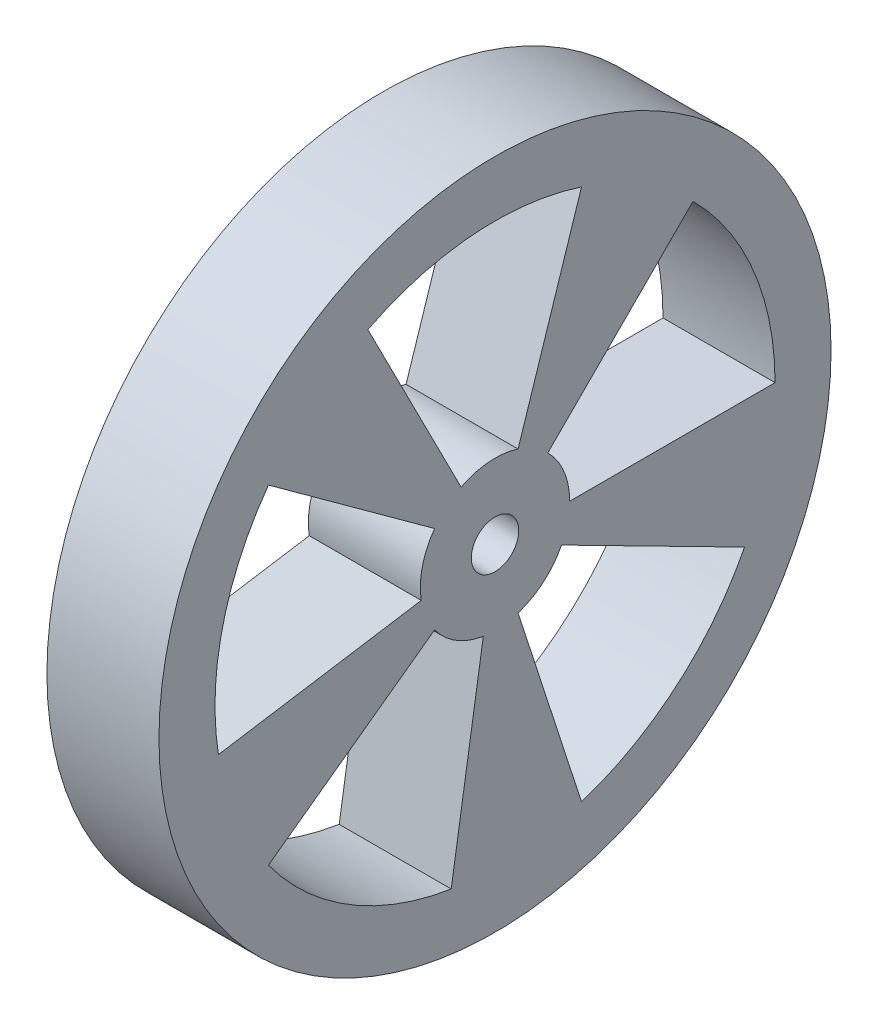
ISO-10303-21;
HEADER;
FILE_DESCRIPTION(('STEP AP214'),'2;1');
FILE_NAME('part.step','',(''),(''),'','','');
FILE_SCHEMA(('AUTOMOTIVE_DESIGN { 1 0 10303 214 1 1 1 1 }'));
ENDSEC;
DATA;
#1=APPLICATION_CONTEXT('core data for automotive mechanical design processes');
#2=APPLICATION_PROTOCOL_DEFINITION('international standard','automotive_design',2000,#1);
#3=PRODUCT_CONTEXT('',#1,'mechanical');
#4=PRODUCT('Part','Part','',(#3));
#5=PRODUCT_RELATED_PRODUCT_CATEGORY('part','',(#4));
#6=PRODUCT_DEFINITION_FORMATION('','',#4);
#7=PRODUCT_DEFINITION_CONTEXT('part definition',#1,'design');
#8=PRODUCT_DEFINITION('design','',#6,#7);
#9=PRODUCT_DEFINITION_SHAPE('','',#8);
#10=(LENGTH_UNIT() NAMED_UNIT(*) SI_UNIT(.MILLI.,.METRE.));
#11=(NAMED_UNIT(*) PLANE_ANGLE_UNIT() SI_UNIT($,.RADIAN.));
#12=(NAMED_UNIT(*) SI_UNIT($,.STERADIAN.) SOLID_ANGLE_UNIT());
#13=UNCERTAINTY_MEASURE_WITH_UNIT(LENGTH_MEASURE(1.E-05),#10,'distance_accuracy_value','');
#14=(GEOMETRIC_REPRESENTATION_CONTEXT(3) GLOBAL_UNCERTAINTY_ASSIGNED_CONTEXT((#13)) GLOBAL_UNIT_ASSIGNED_CONTEXT((#10,
#11,#12)) REPRESENTATION_CONTEXT('',''));
#15=CARTESIAN_POINT('',(0.,0.,0.));
#16=DIRECTION('',(0.,0.,1.));
#17=DIRECTION('',(1.,0.,0.));
#18=AXIS2_PLACEMENT_3D('',#15,#16,#17);
#19=CARTESIAN_POINT('',(30.,0.,0.));
#20=DIRECTION('',(-1.,0.,0.));
#21=DIRECTION('',(0.,0.,1.));
#22=AXIS2_PLACEMENT_3D('',#19,#20,#21);
#23=CYLINDRICAL_SURFACE('',#22,90.);
#24=CARTESIAN_POINT('',(30.,0.,0.));
#25=DIRECTION('',(1.,0.,0.));
#26=DIRECTION('',(0.,0.,-1.));
#27=AXIS2_PLACEMENT_3D('',#24,#25,#26);
#28=CIRCLE('',#27,90.);
#29=CARTESIAN_POINT('',(30.,0.,-90.));
#30=VERTEX_POINT('',#29);
#31=EDGE_CURVE('E11',#30,#30,#28,.T.);
#32=ORIENTED_EDGE('',*,*,#31,.F.);
#33=EDGE_LOOP('',(#32));
#34=FACE_BOUND('',#33,.T.);
#35=CARTESIAN_POINT('',(0.,0.,0.));
#36=DIRECTION('',(1.,0.,0.));
#37=DIRECTION('',(0.,0.,-1.));
#38=AXIS2_PLACEMENT_3D('',#35,#36,#37);
#39=CIRCLE('',#38,90.);
#40=CARTESIAN_POINT('',(0.,0.,-90.));
#41=VERTEX_POINT('',#40);
#42=EDGE_CURVE('E42',#41,#41,#39,.T.);
#43=ORIENTED_EDGE('',*,*,#42,.T.);
#44=EDGE_LOOP('',(#43));
#45=FACE_BOUND('',#44,.T.);
#46=ADVANCED_FACE('F39',(#34,#45),#23,.T.);
#47=CARTESIAN_POINT('',(30.,0.,0.));
#48=DIRECTION('',(1.,0.,0.));
#49=DIRECTION('',(0.,0.,-1.));
#50=AXIS2_PLACEMENT_3D('',#47,#48,#49);
#51=PLANE('',#50);
#52=CARTESIAN_POINT('',(30.,0.,0.));
#53=DIRECTION('',(-1.,0.,0.));
#54=DIRECTION('',(0.,-0.95105651629515,-0.309016994374958));
#55=AXIS2_PLACEMENT_3D('',#52,#53,#54);
#56=CIRCLE('',#55,75.);
#57=CARTESIAN_POINT('',(30.,-34.0492874804656,-66.8254893141278));
#58=VERTEX_POINT('',#57);
#59=CARTESIAN_POINT('',(30.,-71.3292387221363,-23.1762745781219));
#60=VERTEX_POINT('',#59);
#61=EDGE_CURVE('E250',#58,#60,#56,.T.);
#62=ORIENTED_EDGE('',*,*,#61,.T.);
#63=DIRECTION('',(0.,0.95105651629515,0.309016994374958));
#64=VECTOR('',#63,1.);
#65=CARTESIAN_POINT('',(30.,-19.021130325903,-6.18033988749916));
#66=LINE('',#65,#64);
#67=CARTESIAN_POINT('',(30.,-19.021130325903,-6.18033988749916));
#68=VERTEX_POINT('',#67);
#69=EDGE_CURVE('E253',#60,#68,#66,.T.);
#70=ORIENTED_EDGE('',*,*,#69,.T.);
#71=CARTESIAN_POINT('',(30.,0.,0.));
#72=DIRECTION('',(1.,0.,0.));
#73=DIRECTION('',(0.,0.95105651629515,0.309016994374958));
#74=AXIS2_PLACEMENT_3D('',#71,#72,#73);
#75=CIRCLE('',#74,20.);
#76=CARTESIAN_POINT('',(30.,-9.07980999479084,-17.8201304837674));
#77=VERTEX_POINT('',#76);
#78=EDGE_CURVE('E53',#68,#77,#75,.T.);
#79=ORIENTED_EDGE('',*,*,#78,.T.);
#80=DIRECTION('',(0.,-0.453990499739542,-0.89100652418837));
#81=VECTOR('',#80,1.);
#82=CARTESIAN_POINT('',(30.,-34.0492874804656,-66.8254893141278));
#83=LINE('',#82,#81);
#84=EDGE_CURVE('E258',#77,#58,#83,.T.);
#85=ORIENTED_EDGE('',*,*,#84,.T.);
#86=EDGE_LOOP('',(#62,#70,#79,#85));
#87=FACE_BOUND('',#86,.T.);
#88=CARTESIAN_POINT('',(30.,0.,0.));
#89=DIRECTION('',(-1.,0.,0.));
#90=DIRECTION('',(0.,-0.58778525229248,0.809016994374942));
#91=AXIS2_PLACEMENT_3D('',#88,#89,#90);
#92=CIRCLE('',#91,75.);
#93=CARTESIAN_POINT('',(30.,-74.0766255446354,11.7325848780171));
#94=VERTEX_POINT('',#93);
#95=CARTESIAN_POINT('',(30.,-44.083893921936,60.6762745781207));
#96=VERTEX_POINT('',#95);
#97=EDGE_CURVE('E220',#94,#96,#92,.T.);
#98=ORIENTED_EDGE('',*,*,#97,.T.);
#99=DIRECTION('',(0.,0.58778525229248,-0.809016994374942));
#100=VECTOR('',#99,1.);
#101=CARTESIAN_POINT('',(30.,-11.7557050458496,16.1803398874988));
#102=LINE('',#101,#100);
#103=CARTESIAN_POINT('',(30.,-11.7557050458496,16.1803398874988));
#104=VERTEX_POINT('',#103);
#105=EDGE_CURVE('E223',#96,#104,#102,.T.);
#106=ORIENTED_EDGE('',*,*,#105,.T.);
#107=CARTESIAN_POINT('',(30.,0.,0.));
#108=DIRECTION('',(1.,0.,0.));
#109=DIRECTION('',(0.,0.58778525229248,-0.809016994374942));
#110=AXIS2_PLACEMENT_3D('',#107,#108,#109);
#111=CIRCLE('',#110,20.);
#112=CARTESIAN_POINT('',(30.,-19.7537668119028,3.12868930080456));
#113=VERTEX_POINT('',#112);
#114=EDGE_CURVE('E61',#104,#113,#111,.T.);
#115=ORIENTED_EDGE('',*,*,#114,.T.);
#116=DIRECTION('',(0.,-0.987688340595138,0.156434465040228));
#117=VECTOR('',#116,1.);
#118=CARTESIAN_POINT('',(30.,-74.0766255446354,11.7325848780171));
#119=LINE('',#118,#117);
#120=EDGE_CURVE('E228',#113,#94,#119,.T.);
#121=ORIENTED_EDGE('',*,*,#120,.T.);
#122=EDGE_LOOP('',(#98,#106,#115,#121));
#123=FACE_BOUND('',#122,.T.);
#124=CARTESIAN_POINT('',(30.,0.,0.));
#125=DIRECTION('',(-1.,0.,0.));
#126=DIRECTION('',(0.,0.587785252292469,0.809016994374951));
#127=AXIS2_PLACEMENT_3D('',#124,#125,#126);
#128=CIRCLE('',#127,75.);
#129=CARTESIAN_POINT('',(30.,-11.7325848780173,74.0766255446353));
#130=VERTEX_POINT('',#129);
#131=CARTESIAN_POINT('',(30.,44.0838939219352,60.6762745781213));
#132=VERTEX_POINT('',#131);
#133=EDGE_CURVE('E179',#130,#132,#128,.T.);
#134=ORIENTED_EDGE('',*,*,#133,.T.);
#135=DIRECTION('',(0.,-0.587785252292469,-0.809016994374951));
#136=VECTOR('',#135,1.);
#137=CARTESIAN_POINT('',(30.,11.7557050458494,16.180339887499));
#138=LINE('',#137,#136);
#139=CARTESIAN_POINT('',(30.,11.7557050458494,16.180339887499));
#140=VERTEX_POINT('',#139);
#141=EDGE_CURVE('E191',#132,#140,#138,.T.);
#142=ORIENTED_EDGE('',*,*,#141,.T.);
#143=CARTESIAN_POINT('',(30.,0.,0.));
#144=DIRECTION('',(1.,0.,0.));
#145=DIRECTION('',(0.,-0.587785252292469,-0.809016994374951));
#146=AXIS2_PLACEMENT_3D('',#143,#144,#145);
#147=CIRCLE('',#146,20.);
#148=CARTESIAN_POINT('',(30.,-3.12868930080461,19.7537668119028));
#149=VERTEX_POINT('',#148);
#150=EDGE_CURVE('E195',#140,#149,#147,.T.);
#151=ORIENTED_EDGE('',*,*,#150,.T.);
#152=DIRECTION('',(0.,-0.156434465040231,0.987688340595138));
#153=VECTOR('',#152,1.);
#154=CARTESIAN_POINT('',(30.,-11.7325848780173,74.0766255446353));
#155=LINE('',#154,#153);
#156=EDGE_CURVE('E187',#149,#130,#155,.T.);
#157=ORIENTED_EDGE('',*,*,#156,.T.);
#158=EDGE_LOOP('',(#134,#142,#151,#157));
#159=FACE_BOUND('',#158,.T.);
#160=CARTESIAN_POINT('',(30.,0.,0.));
#161=DIRECTION('',(-1.,0.,0.));
#162=DIRECTION('',(0.,0.951056516295155,-0.309016994374945));
#163=AXIS2_PLACEMENT_3D('',#160,#161,#162);
#164=CIRCLE('',#163,75.);
#165=CARTESIAN_POINT('',(30.,66.8254893141277,34.0492874804658));
#166=VERTEX_POINT('',#165);
#167=CARTESIAN_POINT('',(30.,71.3292387221366,-23.1762745781209));
#168=VERTEX_POINT('',#167);
#169=EDGE_CURVE('E279',#166,#168,#164,.T.);
#170=ORIENTED_EDGE('',*,*,#169,.T.);
#171=DIRECTION('',(0.,-0.951056516295155,0.309016994374945));
#172=VECTOR('',#171,1.);
#173=CARTESIAN_POINT('',(30.,19.0211303259031,-6.1803398874989));
#174=LINE('',#173,#172);
#175=CARTESIAN_POINT('',(30.,19.0211303259031,-6.1803398874989));
#176=VERTEX_POINT('',#175);
#177=EDGE_CURVE('E282',#168,#176,#174,.T.);
#178=ORIENTED_EDGE('',*,*,#177,.T.);
#179=CARTESIAN_POINT('',(30.,0.,0.));
#180=DIRECTION('',(1.,0.,0.));
#181=DIRECTION('',(0.,-0.951056516295155,0.309016994374945));
#182=AXIS2_PLACEMENT_3D('',#179,#180,#181);
#183=CIRCLE('',#182,20.);
#184=CARTESIAN_POINT('',(30.,17.8201304837674,9.07980999479088));
#185=VERTEX_POINT('',#184);
#186=EDGE_CURVE('E286',#176,#185,#183,.T.);
#187=ORIENTED_EDGE('',*,*,#186,.T.);
#188=DIRECTION('',(0.,0.891006524188369,0.453990499739544));
#189=VECTOR('',#188,1.);
#190=CARTESIAN_POINT('',(30.,66.8254893141277,34.0492874804658));
#191=LINE('',#190,#189);
#192=EDGE_CURVE('E289',#185,#166,#191,.T.);
#193=ORIENTED_EDGE('',*,*,#192,.T.);
#194=EDGE_LOOP('',(#170,#178,#187,#193));
#195=FACE_BOUND('',#194,.T.);
#196=CARTESIAN_POINT('',(30.,0.,0.));
#197=DIRECTION('',(-1.,0.,0.));
#198=DIRECTION('',(0.,0.,-1.));
#199=AXIS2_PLACEMENT_3D('',#196,#197,#198);
#200=CIRCLE('',#199,75.);
#201=CARTESIAN_POINT('',(30.,53.0330085889908,-53.0330085889914));
#202=VERTEX_POINT('',#201);
#203=CARTESIAN_POINT('',(30.,0.,-75.));
#204=VERTEX_POINT('',#203);
#205=EDGE_CURVE('E311',#202,#204,#200,.T.);
#206=ORIENTED_EDGE('',*,*,#205,.T.);
#207=DIRECTION('',(0.,0.,1.));
#208=VECTOR('',#207,1.);
#209=CARTESIAN_POINT('',(30.,0.,-20.));
#210=LINE('',#209,#208);
#211=CARTESIAN_POINT('',(30.,0.,-20.));
#212=VERTEX_POINT('',#211);
#213=EDGE_CURVE('E314',#204,#212,#210,.T.);
#214=ORIENTED_EDGE('',*,*,#213,.T.);
#215=CARTESIAN_POINT('',(30.,0.,0.));
#216=DIRECTION('',(1.,0.,0.));
#217=DIRECTION('',(0.,0.,1.));
#218=AXIS2_PLACEMENT_3D('',#215,#216,#217);
#219=CIRCLE('',#218,20.);
#220=CARTESIAN_POINT('',(30.,14.1421356237309,-14.142135623731));
#221=VERTEX_POINT('',#220);
#222=EDGE_CURVE('E318',#212,#221,#219,.T.);
#223=ORIENTED_EDGE('',*,*,#222,.T.);
#224=DIRECTION('',(0.,0.707106781186543,-0.707106781186552));
#225=VECTOR('',#224,1.);
#226=CARTESIAN_POINT('',(30.,53.0330085889908,-53.0330085889914));
#227=LINE('',#226,#225);
#228=EDGE_CURVE('E321',#221,#202,#227,.T.);
#229=ORIENTED_EDGE('',*,*,#228,.T.);
#230=EDGE_LOOP('',(#206,#214,#223,#229));
#231=FACE_BOUND('',#230,.T.);
#232=CARTESIAN_POINT('',(30.,0.,0.));
#233=DIRECTION('',(-1.,0.,0.));
#234=DIRECTION('',(0.,0.,1.));
#235=AXIS2_PLACEMENT_3D('',#232,#233,#234);
#236=CIRCLE('',#235,6.35);
#237=CARTESIAN_POINT('',(30.,0.,6.35));
#238=VERTEX_POINT('',#237);
#239=EDGE_CURVE('E343',#238,#238,#236,.T.);
#240=ORIENTED_EDGE('',*,*,#239,.T.);
#241=EDGE_LOOP('',(#240));
#242=FACE_BOUND('',#241,.T.);
#243=ORIENTED_EDGE('',*,*,#31,.T.);
#244=EDGE_LOOP('',(#243));
#245=FACE_BOUND('',#244,.T.);
#246=ADVANCED_FACE('F197',(#87,#123,#159,#195,#231,#242,#245),#51,.T.);
#247=CARTESIAN_POINT('',(0.,0.,0.));
#248=DIRECTION('',(1.,0.,0.));
#249=DIRECTION('',(0.,0.,-1.));
#250=AXIS2_PLACEMENT_3D('',#247,#248,#249);
#251=PLANE('',#250);
#252=DIRECTION('',(0.,0.95105651629515,0.309016994374958));
#253=VECTOR('',#252,1.);
#254=CARTESIAN_POINT('',(0.,-19.021130325903,-6.18033988749916));
#255=LINE('',#254,#253);
#256=CARTESIAN_POINT('',(0.,-71.3292387221363,-23.1762745781219));
#257=VERTEX_POINT('',#256);
#258=CARTESIAN_POINT('',(0.,-19.021130325903,-6.18033988749916));
#259=VERTEX_POINT('',#258);
#260=EDGE_CURVE('E264',#257,#259,#255,.T.);
#261=ORIENTED_EDGE('',*,*,#260,.F.);
#262=CARTESIAN_POINT('',(0.,0.,0.));
#263=DIRECTION('',(-1.,0.,0.));
#264=DIRECTION('',(0.,-0.95105651629515,-0.309016994374958));
#265=AXIS2_PLACEMENT_3D('',#262,#263,#264);
#266=CIRCLE('',#265,75.);
#267=CARTESIAN_POINT('',(0.,-34.0492874804656,-66.8254893141278));
#268=VERTEX_POINT('',#267);
#269=EDGE_CURVE('E262',#268,#257,#266,.T.);
#270=ORIENTED_EDGE('',*,*,#269,.F.);
#271=DIRECTION('',(0.,-0.453990499739542,-0.89100652418837));
#272=VECTOR('',#271,1.);
#273=CARTESIAN_POINT('',(0.,-34.0492874804656,-66.8254893141278));
#274=LINE('',#273,#272);
#275=CARTESIAN_POINT('',(0.,-9.07980999479084,-17.8201304837674));
#276=VERTEX_POINT('',#275);
#277=EDGE_CURVE('E254',#276,#268,#274,.T.);
#278=ORIENTED_EDGE('',*,*,#277,.F.);
#279=CARTESIAN_POINT('',(0.,0.,0.));
#280=DIRECTION('',(1.,0.,0.));
#281=DIRECTION('',(0.,0.95105651629515,0.309016994374958));
#282=AXIS2_PLACEMENT_3D('',#279,#280,#281);
#283=CIRCLE('',#282,20.);
#284=EDGE_CURVE('E267',#259,#276,#283,.T.);
#285=ORIENTED_EDGE('',*,*,#284,.F.);
#286=EDGE_LOOP('',(#261,#270,#278,#285));
#287=FACE_BOUND('',#286,.T.);
#288=DIRECTION('',(0.,0.58778525229248,-0.809016994374942));
#289=VECTOR('',#288,1.);
#290=CARTESIAN_POINT('',(0.,-11.7557050458496,16.1803398874988));
#291=LINE('',#290,#289);
#292=CARTESIAN_POINT('',(0.,-44.083893921936,60.6762745781207));
#293=VERTEX_POINT('',#292);
#294=CARTESIAN_POINT('',(0.,-11.7557050458496,16.1803398874988));
#295=VERTEX_POINT('',#294);
#296=EDGE_CURVE('E234',#293,#295,#291,.T.);
#297=ORIENTED_EDGE('',*,*,#296,.F.);
#298=CARTESIAN_POINT('',(0.,0.,0.));
#299=DIRECTION('',(-1.,0.,0.));
#300=DIRECTION('',(0.,-0.58778525229248,0.809016994374942));
#301=AXIS2_PLACEMENT_3D('',#298,#299,#300);
#302=CIRCLE('',#301,75.);
#303=CARTESIAN_POINT('',(0.,-74.0766255446354,11.7325848780171));
#304=VERTEX_POINT('',#303);
#305=EDGE_CURVE('E232',#304,#293,#302,.T.);
#306=ORIENTED_EDGE('',*,*,#305,.F.);
#307=DIRECTION('',(0.,-0.987688340595138,0.156434465040228));
#308=VECTOR('',#307,1.);
#309=CARTESIAN_POINT('',(0.,-74.0766255446354,11.7325848780171));
#310=LINE('',#309,#308);
#311=CARTESIAN_POINT('',(0.,-19.7537668119028,3.12868930080456));
#312=VERTEX_POINT('',#311);
#313=EDGE_CURVE('E224',#312,#304,#310,.T.);
#314=ORIENTED_EDGE('',*,*,#313,.F.);
#315=CARTESIAN_POINT('',(0.,0.,0.));
#316=DIRECTION('',(1.,0.,0.));
#317=DIRECTION('',(0.,0.58778525229248,-0.809016994374942));
#318=AXIS2_PLACEMENT_3D('',#315,#316,#317);
#319=CIRCLE('',#318,20.);
#320=EDGE_CURVE('E238',#295,#312,#319,.T.);
#321=ORIENTED_EDGE('',*,*,#320,.F.);
#322=EDGE_LOOP('',(#297,#306,#314,#321));
#323=FACE_BOUND('',#322,.T.);
#324=DIRECTION('',(0.,-0.587785252292469,-0.809016994374951));
#325=VECTOR('',#324,1.);
#326=CARTESIAN_POINT('',(0.,11.7557050458494,16.180339887499));
#327=LINE('',#326,#325);
#328=CARTESIAN_POINT('',(0.,44.0838939219351,60.6762745781213));
#329=VERTEX_POINT('',#328);
#330=CARTESIAN_POINT('',(0.,11.7557050458494,16.180339887499));
#331=VERTEX_POINT('',#330);
#332=EDGE_CURVE('E209',#329,#331,#327,.T.);
#333=ORIENTED_EDGE('',*,*,#332,.F.);
#334=CARTESIAN_POINT('',(0.,0.,0.));
#335=DIRECTION('',(-1.,0.,0.));
#336=DIRECTION('',(0.,0.587785252292469,0.809016994374951));
#337=AXIS2_PLACEMENT_3D('',#334,#335,#336);
#338=CIRCLE('',#337,75.);
#339=CARTESIAN_POINT('',(0.,-11.7325848780173,74.0766255446353));
#340=VERTEX_POINT('',#339);
#341=EDGE_CURVE('E182',#340,#329,#338,.T.);
#342=ORIENTED_EDGE('',*,*,#341,.F.);
#343=DIRECTION('',(0.,-0.156434465040231,0.987688340595138));
#344=VECTOR('',#343,1.);
#345=CARTESIAN_POINT('',(0.,-11.7325848780173,74.0766255446353));
#346=LINE('',#345,#344);
#347=CARTESIAN_POINT('',(0.,-3.12868930080461,19.7537668119028));
#348=VERTEX_POINT('',#347);
#349=EDGE_CURVE('E200',#348,#340,#346,.T.);
#350=ORIENTED_EDGE('',*,*,#349,.F.);
#351=CARTESIAN_POINT('',(0.,0.,0.));
#352=DIRECTION('',(1.,0.,0.));
#353=DIRECTION('',(0.,-0.587785252292469,-0.809016994374951));
#354=AXIS2_PLACEMENT_3D('',#351,#352,#353);
#355=CIRCLE('',#354,20.);
#356=EDGE_CURVE('E203',#331,#348,#355,.T.);
#357=ORIENTED_EDGE('',*,*,#356,.F.);
#358=EDGE_LOOP('',(#333,#342,#350,#357));
#359=FACE_BOUND('',#358,.T.);
#360=DIRECTION('',(0.,-0.951056516295155,0.309016994374945));
#361=VECTOR('',#360,1.);
#362=CARTESIAN_POINT('',(0.,19.0211303259031,-6.1803398874989));
#363=LINE('',#362,#361);
#364=CARTESIAN_POINT('',(0.,71.3292387221366,-23.1762745781209));
#365=VERTEX_POINT('',#364);
#366=CARTESIAN_POINT('',(0.,19.0211303259031,-6.1803398874989));
#367=VERTEX_POINT('',#366);
#368=EDGE_CURVE('E294',#365,#367,#363,.T.);
#369=ORIENTED_EDGE('',*,*,#368,.F.);
#370=CARTESIAN_POINT('',(0.,0.,0.));
#371=DIRECTION('',(-1.,0.,0.));
#372=DIRECTION('',(0.,0.951056516295155,-0.309016994374945));
#373=AXIS2_PLACEMENT_3D('',#370,#371,#372);
#374=CIRCLE('',#373,75.);
#375=CARTESIAN_POINT('',(0.,66.8254893141277,34.0492874804658));
#376=VERTEX_POINT('',#375);
#377=EDGE_CURVE('E216',#376,#365,#374,.T.);
#378=ORIENTED_EDGE('',*,*,#377,.F.);
#379=DIRECTION('',(0.,0.891006524188369,0.453990499739544));
#380=VECTOR('',#379,1.);
#381=CARTESIAN_POINT('',(0.,66.8254893141277,34.0492874804658));
#382=LINE('',#381,#380);
#383=CARTESIAN_POINT('',(0.,17.8201304837674,9.07980999479088));
#384=VERTEX_POINT('',#383);
#385=EDGE_CURVE('E283',#384,#376,#382,.T.);
#386=ORIENTED_EDGE('',*,*,#385,.F.);
#387=CARTESIAN_POINT('',(0.,0.,0.));
#388=DIRECTION('',(1.,0.,0.));
#389=DIRECTION('',(0.,-0.951056516295155,0.309016994374945));
#390=AXIS2_PLACEMENT_3D('',#387,#388,#389);
#391=CIRCLE('',#390,20.);
#392=EDGE_CURVE('E297',#367,#384,#391,.T.);
#393=ORIENTED_EDGE('',*,*,#392,.F.);
#394=EDGE_LOOP('',(#369,#378,#386,#393));
#395=FACE_BOUND('',#394,.T.);
#396=DIRECTION('',(0.,0.,1.));
#397=VECTOR('',#396,1.);
#398=CARTESIAN_POINT('',(0.,0.,-20.));
#399=LINE('',#398,#397);
#400=CARTESIAN_POINT('',(0.,0.,-75.));
#401=VERTEX_POINT('',#400);
#402=CARTESIAN_POINT('',(0.,0.,-20.));
#403=VERTEX_POINT('',#402);
#404=EDGE_CURVE('E326',#401,#403,#399,.T.);
#405=ORIENTED_EDGE('',*,*,#404,.F.);
#406=CARTESIAN_POINT('',(0.,0.,0.));
#407=DIRECTION('',(-1.,0.,0.));
#408=DIRECTION('',(0.,0.,-1.));
#409=AXIS2_PLACEMENT_3D('',#406,#407,#408);
#410=CIRCLE('',#409,75.);
#411=CARTESIAN_POINT('',(0.,53.0330085889908,-53.0330085889914));
#412=VERTEX_POINT('',#411);
#413=EDGE_CURVE('E304',#412,#401,#410,.T.);
#414=ORIENTED_EDGE('',*,*,#413,.F.);
#415=DIRECTION('',(0.,0.707106781186543,-0.707106781186552));
#416=VECTOR('',#415,1.);
#417=CARTESIAN_POINT('',(0.,53.0330085889908,-53.0330085889914));
#418=LINE('',#417,#416);
#419=CARTESIAN_POINT('',(0.,14.1421356237309,-14.142135623731));
#420=VERTEX_POINT('',#419);
#421=EDGE_CURVE('E315',#420,#412,#418,.T.);
#422=ORIENTED_EDGE('',*,*,#421,.F.);
#423=CARTESIAN_POINT('',(0.,0.,0.));
#424=DIRECTION('',(1.,0.,0.));
#425=DIRECTION('',(0.,0.,1.));
#426=AXIS2_PLACEMENT_3D('',#423,#424,#425);
#427=CIRCLE('',#426,20.);
#428=EDGE_CURVE('E329',#403,#420,#427,.T.);
#429=ORIENTED_EDGE('',*,*,#428,.F.);
#430=EDGE_LOOP('',(#405,#414,#422,#429));
#431=FACE_BOUND('',#430,.T.);
#432=CARTESIAN_POINT('',(0.,0.,0.));
#433=DIRECTION('',(-1.,0.,0.));
#434=DIRECTION('',(0.,0.,1.));
#435=AXIS2_PLACEMENT_3D('',#432,#433,#434);
#436=CIRCLE('',#435,6.35);
#437=CARTESIAN_POINT('',(0.,0.,6.35));
#438=VERTEX_POINT('',#437);
#439=EDGE_CURVE('E336',#438,#438,#436,.T.);
#440=ORIENTED_EDGE('',*,*,#439,.F.);
#441=EDGE_LOOP('',(#440));
#442=FACE_BOUND('',#441,.T.);
#443=ORIENTED_EDGE('',*,*,#42,.F.);
#444=EDGE_LOOP('',(#443));
#445=FACE_BOUND('',#444,.T.);
#446=ADVANCED_FACE('F351',(#287,#323,#359,#395,#431,#442,#445),#251,.F.);
#447=CARTESIAN_POINT('',(30.,0.,0.));
#448=DIRECTION('',(-1.,0.,0.));
#449=DIRECTION('',(0.,0.,1.));
#450=AXIS2_PLACEMENT_3D('',#447,#448,#449);
#451=CYLINDRICAL_SURFACE('',#450,6.35);
#452=ORIENTED_EDGE('',*,*,#239,.F.);
#453=EDGE_LOOP('',(#452));
#454=FACE_BOUND('',#453,.T.);
#455=ORIENTED_EDGE('',*,*,#439,.T.);
#456=EDGE_LOOP('',(#455));
#457=FACE_BOUND('',#456,.T.);
#458=ADVANCED_FACE('F349',(#454,#457),#451,.F.);
#459=CARTESIAN_POINT('',(30.,0.,0.));
#460=DIRECTION('',(-1.,0.,0.));
#461=DIRECTION('',(0.,0.,1.));
#462=AXIS2_PLACEMENT_3D('',#459,#460,#461);
#463=CYLINDRICAL_SURFACE('',#462,75.);
#464=ORIENTED_EDGE('',*,*,#413,.T.);
#465=DIRECTION('',(-1.,0.,0.));
#466=VECTOR('',#465,1.);
#467=CARTESIAN_POINT('',(30.,0.,-75.));
#468=LINE('',#467,#466);
#469=EDGE_CURVE('E324',#204,#401,#468,.T.);
#470=ORIENTED_EDGE('',*,*,#469,.F.);
#471=ORIENTED_EDGE('',*,*,#205,.F.);
#472=DIRECTION('',(-1.,0.,0.));
#473=VECTOR('',#472,1.);
#474=CARTESIAN_POINT('',(30.,53.0330085889908,-53.0330085889914));
#475=LINE('',#474,#473);
#476=EDGE_CURVE('E334',#202,#412,#475,.T.);
#477=ORIENTED_EDGE('',*,*,#476,.T.);
#478=EDGE_LOOP('',(#464,#470,#471,#477));
#479=FACE_BOUND('',#478,.T.);
#480=ADVANCED_FACE('F374',(#479),#463,.F.);
#481=CARTESIAN_POINT('',(30.,53.0330085889908,-53.0330085889914));
#482=DIRECTION('',(0.,0.707106781186552,0.707106781186543));
#483=DIRECTION('',(0.,-0.707106781186543,0.707106781186552));
#484=AXIS2_PLACEMENT_3D('',#481,#482,#483);
#485=PLANE('',#484);
#486=ORIENTED_EDGE('',*,*,#421,.T.);
#487=ORIENTED_EDGE('',*,*,#476,.F.);
#488=ORIENTED_EDGE('',*,*,#228,.F.);
#489=DIRECTION('',(-1.,0.,0.));
#490=VECTOR('',#489,1.);
#491=CARTESIAN_POINT('',(30.,14.1421356237309,-14.142135623731));
#492=LINE('',#491,#490);
#493=EDGE_CURVE('E337',#221,#420,#492,.T.);
#494=ORIENTED_EDGE('',*,*,#493,.T.);
#495=EDGE_LOOP('',(#486,#487,#488,#494));
#496=FACE_BOUND('',#495,.T.);
#497=ADVANCED_FACE('F378',(#496),#485,.F.);
#498=CARTESIAN_POINT('',(30.,0.,0.));
#499=DIRECTION('',(-1.,0.,0.));
#500=DIRECTION('',(0.,0.,1.));
#501=AXIS2_PLACEMENT_3D('',#498,#499,#500);
#502=CYLINDRICAL_SURFACE('',#501,20.);
#503=ORIENTED_EDGE('',*,*,#428,.T.);
#504=ORIENTED_EDGE('',*,*,#493,.F.);
#505=ORIENTED_EDGE('',*,*,#222,.F.);
#506=DIRECTION('',(-1.,0.,0.));
#507=VECTOR('',#506,1.);
#508=CARTESIAN_POINT('',(30.,0.,-20.));
#509=LINE('',#508,#507);
#510=EDGE_CURVE('E339',#212,#403,#509,.T.);
#511=ORIENTED_EDGE('',*,*,#510,.T.);
#512=EDGE_LOOP('',(#503,#504,#505,#511));
#513=FACE_BOUND('',#512,.T.);
#514=ADVANCED_FACE('F383',(#513),#502,.T.);
#515=CARTESIAN_POINT('',(30.,0.,-20.));
#516=DIRECTION('',(0.,-1.,0.));
#517=DIRECTION('',(0.,0.,-1.));
#518=AXIS2_PLACEMENT_3D('',#515,#516,#517);
#519=PLANE('',#518);
#520=ORIENTED_EDGE('',*,*,#404,.T.);
#521=ORIENTED_EDGE('',*,*,#510,.F.);
#522=ORIENTED_EDGE('',*,*,#213,.F.);
#523=ORIENTED_EDGE('',*,*,#469,.T.);
#524=EDGE_LOOP('',(#520,#521,#522,#523));
#525=FACE_BOUND('',#524,.T.);
#526=ADVANCED_FACE('F380',(#525),#519,.F.);
#527=CARTESIAN_POINT('',(30.,0.,0.));
#528=DIRECTION('',(-1.,0.,0.));
#529=DIRECTION('',(0.,0.,1.));
#530=AXIS2_PLACEMENT_3D('',#527,#528,#529);
#531=CYLINDRICAL_SURFACE('',#530,75.);
#532=ORIENTED_EDGE('',*,*,#377,.T.);
#533=DIRECTION('',(-1.,0.,0.));
#534=VECTOR('',#533,1.);
#535=CARTESIAN_POINT('',(30.,71.3292387221366,-23.1762745781209));
#536=LINE('',#535,#534);
#537=EDGE_CURVE('E292',#168,#365,#536,.T.);
#538=ORIENTED_EDGE('',*,*,#537,.F.);
#539=ORIENTED_EDGE('',*,*,#169,.F.);
#540=DIRECTION('',(-1.,0.,0.));
#541=VECTOR('',#540,1.);
#542=CARTESIAN_POINT('',(30.,66.8254893141277,34.0492874804658));
#543=LINE('',#542,#541);
#544=EDGE_CURVE('E302',#166,#376,#543,.T.);
#545=ORIENTED_EDGE('',*,*,#544,.T.);
#546=EDGE_LOOP('',(#532,#538,#539,#545));
#547=FACE_BOUND('',#546,.T.);
#548=ADVANCED_FACE('F382',(#547),#531,.F.);
#549=CARTESIAN_POINT('',(30.,66.8254893141277,34.0492874804658));
#550=DIRECTION('',(0.,-0.453990499739544,0.891006524188369));
#551=DIRECTION('',(0.,-0.891006524188369,-0.453990499739544));
#552=AXIS2_PLACEMENT_3D('',#549,#550,#551);
#553=PLANE('',#552);
#554=ORIENTED_EDGE('',*,*,#385,.T.);
#555=ORIENTED_EDGE('',*,*,#544,.F.);
#556=ORIENTED_EDGE('',*,*,#192,.F.);
#557=DIRECTION('',(-1.,0.,0.));
#558=VECTOR('',#557,1.);
#559=CARTESIAN_POINT('',(30.,17.8201304837674,9.07980999479088));
#560=LINE('',#559,#558);
#561=EDGE_CURVE('E305',#185,#384,#560,.T.);
#562=ORIENTED_EDGE('',*,*,#561,.T.);
#563=EDGE_LOOP('',(#554,#555,#556,#562));
#564=FACE_BOUND('',#563,.T.);
#565=ADVANCED_FACE('F393',(#564),#553,.F.);
#566=CARTESIAN_POINT('',(30.,0.,0.));
#567=DIRECTION('',(-1.,0.,0.));
#568=DIRECTION('',(0.,0.,1.));
#569=AXIS2_PLACEMENT_3D('',#566,#567,#568);
#570=CYLINDRICAL_SURFACE('',#569,20.);
#571=ORIENTED_EDGE('',*,*,#392,.T.);
#572=ORIENTED_EDGE('',*,*,#561,.F.);
#573=ORIENTED_EDGE('',*,*,#186,.F.);
#574=DIRECTION('',(-1.,0.,0.));
#575=VECTOR('',#574,1.);
#576=CARTESIAN_POINT('',(30.,19.0211303259031,-6.1803398874989));
#577=LINE('',#576,#575);
#578=EDGE_CURVE('E307',#176,#367,#577,.T.);
#579=ORIENTED_EDGE('',*,*,#578,.T.);
#580=EDGE_LOOP('',(#571,#572,#573,#579));
#581=FACE_BOUND('',#580,.T.);
#582=ADVANCED_FACE('F398',(#581),#570,.T.);
#583=CARTESIAN_POINT('',(30.,19.0211303259031,-6.1803398874989));
#584=DIRECTION('',(0.,-0.309016994374945,-0.951056516295154));
#585=DIRECTION('',(0.,0.951056516295154,-0.309016994374945));
#586=AXIS2_PLACEMENT_3D('',#583,#584,#585);
#587=PLANE('',#586);
#588=ORIENTED_EDGE('',*,*,#368,.T.);
#589=ORIENTED_EDGE('',*,*,#578,.F.);
#590=ORIENTED_EDGE('',*,*,#177,.F.);
#591=ORIENTED_EDGE('',*,*,#537,.T.);
#592=EDGE_LOOP('',(#588,#589,#590,#591));
#593=FACE_BOUND('',#592,.T.);
#594=ADVANCED_FACE('F395',(#593),#587,.F.);
#595=CARTESIAN_POINT('',(30.,0.,0.));
#596=DIRECTION('',(-1.,0.,0.));
#597=DIRECTION('',(0.,0.,1.));
#598=AXIS2_PLACEMENT_3D('',#595,#596,#597);
#599=CYLINDRICAL_SURFACE('',#598,75.);
#600=ORIENTED_EDGE('',*,*,#341,.T.);
#601=DIRECTION('',(-1.,0.,0.));
#602=VECTOR('',#601,1.);
#603=CARTESIAN_POINT('',(30.,44.0838939219352,60.6762745781213));
#604=LINE('',#603,#602);
#605=EDGE_CURVE('E175',#132,#329,#604,.T.);
#606=ORIENTED_EDGE('',*,*,#605,.F.);
#607=ORIENTED_EDGE('',*,*,#133,.F.);
#608=DIRECTION('',(-1.,0.,0.));
#609=VECTOR('',#608,1.);
#610=CARTESIAN_POINT('',(30.,-11.7325848780173,74.0766255446353));
#611=LINE('',#610,#609);
#612=EDGE_CURVE('E214',#130,#340,#611,.T.);
#613=ORIENTED_EDGE('',*,*,#612,.T.);
#614=EDGE_LOOP('',(#600,#606,#607,#613));
#615=FACE_BOUND('',#614,.T.);
#616=ADVANCED_FACE('F177',(#615),#599,.F.);
#617=CARTESIAN_POINT('',(30.,-11.7325848780173,74.0766255446353));
#618=DIRECTION('',(0.,-0.987688340595138,-0.156434465040231));
#619=DIRECTION('',(0.,0.156434465040231,-0.987688340595138));
#620=AXIS2_PLACEMENT_3D('',#617,#618,#619);
#621=PLANE('',#620);
#622=ORIENTED_EDGE('',*,*,#349,.T.);
#623=ORIENTED_EDGE('',*,*,#612,.F.);
#624=ORIENTED_EDGE('',*,*,#156,.F.);
#625=DIRECTION('',(-1.,0.,0.));
#626=VECTOR('',#625,1.);
#627=CARTESIAN_POINT('',(30.,-3.12868930080461,19.7537668119028));
#628=LINE('',#627,#626);
#629=EDGE_CURVE('E217',#149,#348,#628,.T.);
#630=ORIENTED_EDGE('',*,*,#629,.T.);
#631=EDGE_LOOP('',(#622,#623,#624,#630));
#632=FACE_BOUND('',#631,.T.);
#633=ADVANCED_FACE('F438',(#632),#621,.F.);
#634=CARTESIAN_POINT('',(30.,0.,0.));
#635=DIRECTION('',(-1.,0.,0.));
#636=DIRECTION('',(0.,0.,1.));
#637=AXIS2_PLACEMENT_3D('',#634,#635,#636);
#638=CYLINDRICAL_SURFACE('',#637,20.);
#639=ORIENTED_EDGE('',*,*,#356,.T.);
#640=ORIENTED_EDGE('',*,*,#629,.F.);
#641=ORIENTED_EDGE('',*,*,#150,.F.);
#642=DIRECTION('',(-1.,0.,0.));
#643=VECTOR('',#642,1.);
#644=CARTESIAN_POINT('',(30.,11.7557050458494,16.180339887499));
#645=LINE('',#644,#643);
#646=EDGE_CURVE('E186',#140,#331,#645,.T.);
#647=ORIENTED_EDGE('',*,*,#646,.T.);
#648=EDGE_LOOP('',(#639,#640,#641,#647));
#649=FACE_BOUND('',#648,.T.);
#650=ADVANCED_FACE('F441',(#649),#638,.T.);
#651=CARTESIAN_POINT('',(30.,11.7557050458494,16.180339887499));
#652=DIRECTION('',(0.,0.809016994374951,-0.587785252292469));
#653=DIRECTION('',(0.,0.587785252292469,0.809016994374951));
#654=AXIS2_PLACEMENT_3D('',#651,#652,#653);
#655=PLANE('',#654);
#656=ORIENTED_EDGE('',*,*,#332,.T.);
#657=ORIENTED_EDGE('',*,*,#646,.F.);
#658=ORIENTED_EDGE('',*,*,#141,.F.);
#659=ORIENTED_EDGE('',*,*,#605,.T.);
#660=EDGE_LOOP('',(#656,#657,#658,#659));
#661=FACE_BOUND('',#660,.T.);
#662=ADVANCED_FACE('F192',(#661),#655,.F.);
#663=CARTESIAN_POINT('',(30.,0.,0.));
#664=DIRECTION('',(-1.,0.,0.));
#665=DIRECTION('',(0.,0.,1.));
#666=AXIS2_PLACEMENT_3D('',#663,#664,#665);
#667=CYLINDRICAL_SURFACE('',#666,75.);
#668=ORIENTED_EDGE('',*,*,#305,.T.);
#669=DIRECTION('',(-1.,0.,0.));
#670=VECTOR('',#669,1.);
#671=CARTESIAN_POINT('',(30.,-44.083893921936,60.6762745781207));
#672=LINE('',#671,#670);
#673=EDGE_CURVE('E231',#96,#293,#672,.T.);
#674=ORIENTED_EDGE('',*,*,#673,.F.);
#675=ORIENTED_EDGE('',*,*,#97,.F.);
#676=DIRECTION('',(-1.,0.,0.));
#677=VECTOR('',#676,1.);
#678=CARTESIAN_POINT('',(30.,-74.0766255446354,11.7325848780171));
#679=LINE('',#678,#677);
#680=EDGE_CURVE('E210',#94,#304,#679,.T.);
#681=ORIENTED_EDGE('',*,*,#680,.T.);
#682=EDGE_LOOP('',(#668,#674,#675,#681));
#683=FACE_BOUND('',#682,.T.);
#684=ADVANCED_FACE('F422',(#683),#667,.F.);
#685=CARTESIAN_POINT('',(30.,-74.0766255446354,11.7325848780171));
#686=DIRECTION('',(0.,-0.156434465040228,-0.987688340595138));
#687=DIRECTION('',(0.,0.987688340595138,-0.156434465040228));
#688=AXIS2_PLACEMENT_3D('',#685,#686,#687);
#689=PLANE('',#688);
#690=ORIENTED_EDGE('',*,*,#313,.T.);
#691=ORIENTED_EDGE('',*,*,#680,.F.);
#692=ORIENTED_EDGE('',*,*,#120,.F.);
#693=DIRECTION('',(-1.,0.,0.));
#694=VECTOR('',#693,1.);
#695=CARTESIAN_POINT('',(30.,-19.7537668119028,3.12868930080456));
#696=LINE('',#695,#694);
#697=EDGE_CURVE('E244',#113,#312,#696,.T.);
#698=ORIENTED_EDGE('',*,*,#697,.T.);
#699=EDGE_LOOP('',(#690,#691,#692,#698));
#700=FACE_BOUND('',#699,.T.);
#701=ADVANCED_FACE('F425',(#700),#689,.F.);
#702=CARTESIAN_POINT('',(30.,0.,0.));
#703=DIRECTION('',(-1.,0.,0.));
#704=DIRECTION('',(0.,0.,1.));
#705=AXIS2_PLACEMENT_3D('',#702,#703,#704);
#706=CYLINDRICAL_SURFACE('',#705,20.);
#707=ORIENTED_EDGE('',*,*,#320,.T.);
#708=ORIENTED_EDGE('',*,*,#697,.F.);
#709=ORIENTED_EDGE('',*,*,#114,.F.);
#710=DIRECTION('',(-1.,0.,0.));
#711=VECTOR('',#710,1.);
#712=CARTESIAN_POINT('',(30.,-11.7557050458496,16.1803398874988));
#713=LINE('',#712,#711);
#714=EDGE_CURVE('E246',#104,#295,#713,.T.);
#715=ORIENTED_EDGE('',*,*,#714,.T.);
#716=EDGE_LOOP('',(#707,#708,#709,#715));
#717=FACE_BOUND('',#716,.T.);
#718=ADVANCED_FACE('F429',(#717),#706,.T.);
#719=CARTESIAN_POINT('',(30.,-11.7557050458496,16.1803398874988));
#720=DIRECTION('',(0.,0.809016994374942,0.58778525229248));
#721=DIRECTION('',(0.,-0.58778525229248,0.809016994374942));
#722=AXIS2_PLACEMENT_3D('',#719,#720,#721);
#723=PLANE('',#722);
#724=ORIENTED_EDGE('',*,*,#296,.T.);
#725=ORIENTED_EDGE('',*,*,#714,.F.);
#726=ORIENTED_EDGE('',*,*,#105,.F.);
#727=ORIENTED_EDGE('',*,*,#673,.T.);
#728=EDGE_LOOP('',(#724,#725,#726,#727));
#729=FACE_BOUND('',#728,.T.);
#730=ADVANCED_FACE('F410',(#729),#723,.F.);
#731=CARTESIAN_POINT('',(30.,0.,0.));
#732=DIRECTION('',(-1.,0.,0.));
#733=DIRECTION('',(0.,0.,1.));
#734=AXIS2_PLACEMENT_3D('',#731,#732,#733);
#735=CYLINDRICAL_SURFACE('',#734,75.);
#736=ORIENTED_EDGE('',*,*,#269,.T.);
#737=DIRECTION('',(-1.,0.,0.));
#738=VECTOR('',#737,1.);
#739=CARTESIAN_POINT('',(30.,-71.3292387221363,-23.1762745781219));
#740=LINE('',#739,#738);
#741=EDGE_CURVE('E261',#60,#257,#740,.T.);
#742=ORIENTED_EDGE('',*,*,#741,.F.);
#743=ORIENTED_EDGE('',*,*,#61,.F.);
#744=DIRECTION('',(-1.,0.,0.));
#745=VECTOR('',#744,1.);
#746=CARTESIAN_POINT('',(30.,-34.0492874804656,-66.8254893141278));
#747=LINE('',#746,#745);
#748=EDGE_CURVE('E235',#58,#268,#747,.T.);
#749=ORIENTED_EDGE('',*,*,#748,.T.);
#750=EDGE_LOOP('',(#736,#742,#743,#749));
#751=FACE_BOUND('',#750,.T.);
#752=ADVANCED_FACE('F406',(#751),#735,.F.);
#753=CARTESIAN_POINT('',(30.,-34.0492874804656,-66.8254893141278));
#754=DIRECTION('',(0.,0.891006524188371,-0.453990499739542));
#755=DIRECTION('',(0.,0.453990499739542,0.891006524188371));
#756=AXIS2_PLACEMENT_3D('',#753,#754,#755);
#757=PLANE('',#756);
#758=ORIENTED_EDGE('',*,*,#277,.T.);
#759=ORIENTED_EDGE('',*,*,#748,.F.);
#760=ORIENTED_EDGE('',*,*,#84,.F.);
#761=DIRECTION('',(-1.,0.,0.));
#762=VECTOR('',#761,1.);
#763=CARTESIAN_POINT('',(30.,-9.07980999479084,-17.8201304837674));
#764=LINE('',#763,#762);
#765=EDGE_CURVE('E273',#77,#276,#764,.T.);
#766=ORIENTED_EDGE('',*,*,#765,.T.);
#767=EDGE_LOOP('',(#758,#759,#760,#766));
#768=FACE_BOUND('',#767,.T.);
#769=ADVANCED_FACE('F409',(#768),#757,.F.);
#770=CARTESIAN_POINT('',(30.,0.,0.));
#771=DIRECTION('',(-1.,0.,0.));
#772=DIRECTION('',(0.,0.,1.));
#773=AXIS2_PLACEMENT_3D('',#770,#771,#772);
#774=CYLINDRICAL_SURFACE('',#773,20.);
#775=ORIENTED_EDGE('',*,*,#284,.T.);
#776=ORIENTED_EDGE('',*,*,#765,.F.);
#777=ORIENTED_EDGE('',*,*,#78,.F.);
#778=DIRECTION('',(-1.,0.,0.));
#779=VECTOR('',#778,1.);
#780=CARTESIAN_POINT('',(30.,-19.021130325903,-6.18033988749916));
#781=LINE('',#780,#779);
#782=EDGE_CURVE('E275',#68,#259,#781,.T.);
#783=ORIENTED_EDGE('',*,*,#782,.T.);
#784=EDGE_LOOP('',(#775,#776,#777,#783));
#785=FACE_BOUND('',#784,.T.);
#786=ADVANCED_FACE('F415',(#785),#774,.T.);
#787=CARTESIAN_POINT('',(30.,-19.021130325903,-6.18033988749916));
#788=DIRECTION('',(0.,-0.309016994374958,0.95105651629515));
#789=DIRECTION('',(0.,-0.95105651629515,-0.309016994374958));
#790=AXIS2_PLACEMENT_3D('',#787,#788,#789);
#791=PLANE('',#790);
#792=ORIENTED_EDGE('',*,*,#260,.T.);
#793=ORIENTED_EDGE('',*,*,#782,.F.);
#794=ORIENTED_EDGE('',*,*,#69,.F.);
#795=ORIENTED_EDGE('',*,*,#741,.T.);
#796=EDGE_LOOP('',(#792,#793,#794,#795));
#797=FACE_BOUND('',#796,.T.);
#798=ADVANCED_FACE('F412',(#797),#791,.F.);
#799=CLOSED_SHELL('',(#46,#246,#446,#458,#480,#497,#514,#526,#548,#565,#582,#594,#616,#633,#650,
#662,#684,#701,#718,#730,#752,#769,#786,#798));
#800=MANIFOLD_SOLID_BREP('B2',#799);
#801=ADVANCED_BREP_SHAPE_REPRESENTATION('',(#18,#800),#14);
#802=SHAPE_DEFINITION_REPRESENTATION(#9,#801);
ENDSEC;
END-ISO-10303-21;
